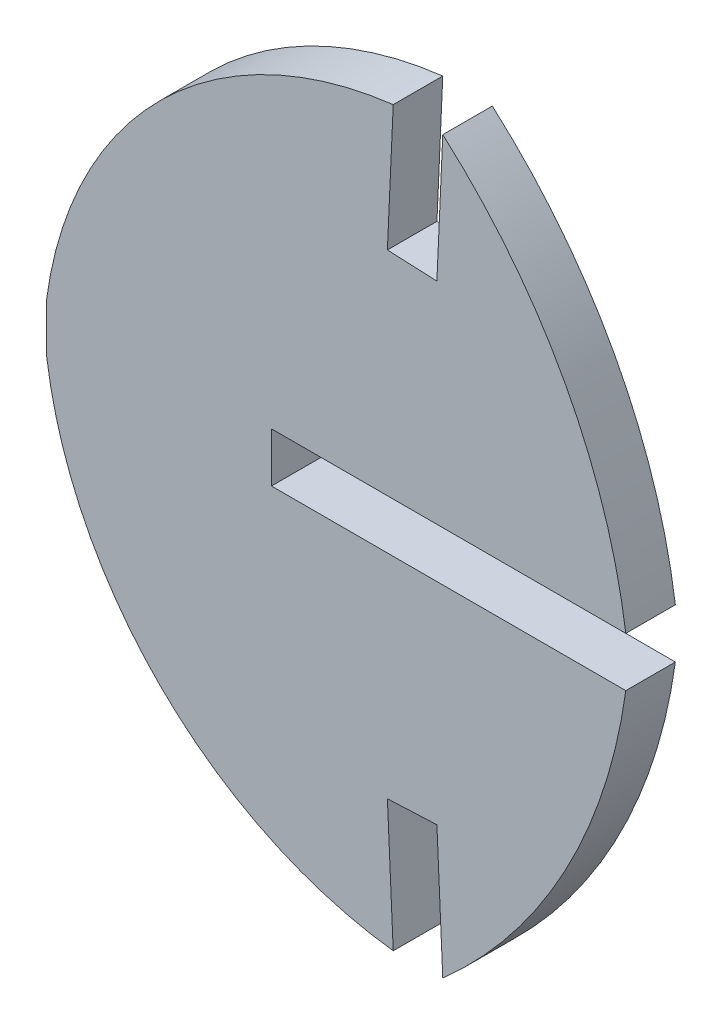
ISO-10303-21;
HEADER;
FILE_DESCRIPTION(('STEP AP214'),'2;1');
FILE_NAME('part.step','',(''),(''),'','','');
FILE_SCHEMA(('AUTOMOTIVE_DESIGN { 1 0 10303 214 1 1 1 1 }'));
ENDSEC;
DATA;
#1=APPLICATION_CONTEXT('core data for automotive mechanical design processes');
#2=APPLICATION_PROTOCOL_DEFINITION('international standard','automotive_design',2000,#1);
#3=PRODUCT_CONTEXT('',#1,'mechanical');
#4=PRODUCT('Part','Part','',(#3));
#5=PRODUCT_RELATED_PRODUCT_CATEGORY('part','',(#4));
#6=PRODUCT_DEFINITION_FORMATION('','',#4);
#7=PRODUCT_DEFINITION_CONTEXT('part definition',#1,'design');
#8=PRODUCT_DEFINITION('design','',#6,#7);
#9=PRODUCT_DEFINITION_SHAPE('','',#8);
#10=(LENGTH_UNIT() NAMED_UNIT(*) SI_UNIT(.MILLI.,.METRE.));
#11=(NAMED_UNIT(*) PLANE_ANGLE_UNIT() SI_UNIT($,.RADIAN.));
#12=(NAMED_UNIT(*) SI_UNIT($,.STERADIAN.) SOLID_ANGLE_UNIT());
#13=UNCERTAINTY_MEASURE_WITH_UNIT(LENGTH_MEASURE(1.E-05),#10,'distance_accuracy_value','');
#14=(GEOMETRIC_REPRESENTATION_CONTEXT(3) GLOBAL_UNCERTAINTY_ASSIGNED_CONTEXT((#13)) GLOBAL_UNIT_ASSIGNED_CONTEXT((#10,
#11,#12)) REPRESENTATION_CONTEXT('',''));
#15=CARTESIAN_POINT('',(0.,0.,0.));
#16=DIRECTION('',(0.,0.,1.));
#17=DIRECTION('',(1.,0.,0.));
#18=AXIS2_PLACEMENT_3D('',#15,#16,#17);
#19=CARTESIAN_POINT('',(68.0534257236926,-1.524,1.524));
#20=DIRECTION('',(0.,-1.,0.));
#21=DIRECTION('',(0.,0.,-1.));
#22=AXIS2_PLACEMENT_3D('',#19,#20,#21);
#23=PLANE('',#22);
#24=DIRECTION('',(-1.,0.,0.));
#25=VECTOR('',#24,1.);
#26=CARTESIAN_POINT('',(68.0534257236926,-1.524,0.));
#27=LINE('',#26,#25);
#28=CARTESIAN_POINT('',(78.9516589196637,-1.52399999999999,0.));
#29=VERTEX_POINT('',#28);
#30=CARTESIAN_POINT('',(68.0534257236926,-1.524,0.));
#31=VERTEX_POINT('',#30);
#32=EDGE_CURVE('E165',#29,#31,#27,.T.);
#33=ORIENTED_EDGE('',*,*,#32,.T.);
#34=DIRECTION('',(0.,0.,-1.));
#35=VECTOR('',#34,1.);
#36=CARTESIAN_POINT('',(68.0534257236926,-1.524,1.524));
#37=LINE('',#36,#35);
#38=CARTESIAN_POINT('',(68.0534257236926,-1.524,1.524));
#39=VERTEX_POINT('',#38);
#40=EDGE_CURVE('E11',#39,#31,#37,.T.);
#41=ORIENTED_EDGE('',*,*,#40,.F.);
#42=DIRECTION('',(-1.,0.,0.));
#43=VECTOR('',#42,1.);
#44=CARTESIAN_POINT('',(68.0534257236926,-1.524,1.524));
#45=LINE('',#44,#43);
#46=CARTESIAN_POINT('',(78.9516589196637,-1.52399999999999,1.524));
#47=VERTEX_POINT('',#46);
#48=EDGE_CURVE('E191',#47,#39,#45,.T.);
#49=ORIENTED_EDGE('',*,*,#48,.F.);
#50=DIRECTION('',(0.,0.,-1.));
#51=VECTOR('',#50,1.);
#52=CARTESIAN_POINT('',(78.9516589196637,-1.52399999999999,1.524));
#53=LINE('',#52,#51);
#54=EDGE_CURVE('E161',#47,#29,#53,.T.);
#55=ORIENTED_EDGE('',*,*,#54,.T.);
#56=EDGE_LOOP('',(#33,#41,#49,#55));
#57=FACE_BOUND('',#56,.T.);
#58=ADVANCED_FACE('F33',(#57),#23,.F.);
#59=CARTESIAN_POINT('',(68.0534257236926,0.,1.524));
#60=DIRECTION('',(-1.,0.,0.));
#61=DIRECTION('',(0.,0.,1.));
#62=AXIS2_PLACEMENT_3D('',#59,#60,#61);
#63=PLANE('',#62);
#64=DIRECTION('',(0.,1.,0.));
#65=VECTOR('',#64,1.);
#66=CARTESIAN_POINT('',(68.0534257236926,0.,0.));
#67=LINE('',#66,#65);
#68=CARTESIAN_POINT('',(68.0534257236926,0.,0.));
#69=VERTEX_POINT('',#68);
#70=EDGE_CURVE('E168',#31,#69,#67,.T.);
#71=ORIENTED_EDGE('',*,*,#70,.T.);
#72=DIRECTION('',(0.,0.,-1.));
#73=VECTOR('',#72,1.);
#74=CARTESIAN_POINT('',(68.0534257236926,0.,1.524));
#75=LINE('',#74,#73);
#76=CARTESIAN_POINT('',(68.0534257236926,0.,1.524));
#77=VERTEX_POINT('',#76);
#78=EDGE_CURVE('E41',#77,#69,#75,.T.);
#79=ORIENTED_EDGE('',*,*,#78,.F.);
#80=DIRECTION('',(0.,1.,0.));
#81=VECTOR('',#80,1.);
#82=CARTESIAN_POINT('',(68.0534257236926,0.,1.524));
#83=LINE('',#82,#81);
#84=EDGE_CURVE('E110',#39,#77,#83,.T.);
#85=ORIENTED_EDGE('',*,*,#84,.F.);
#86=ORIENTED_EDGE('',*,*,#40,.T.);
#87=EDGE_LOOP('',(#71,#79,#85,#86));
#88=FACE_BOUND('',#87,.T.);
#89=ADVANCED_FACE('F279',(#88),#63,.F.);
#90=CARTESIAN_POINT('',(68.0534257236926,0.,1.524));
#91=DIRECTION('',(0.,1.,0.));
#92=DIRECTION('',(0.,0.,1.));
#93=AXIS2_PLACEMENT_3D('',#90,#91,#92);
#94=PLANE('',#93);
#95=DIRECTION('',(1.,0.,0.));
#96=VECTOR('',#95,1.);
#97=CARTESIAN_POINT('',(68.0534257236926,0.,0.));
#98=LINE('',#97,#96);
#99=CARTESIAN_POINT('',(78.9516589196637,0.,0.));
#100=VERTEX_POINT('',#99);
#101=EDGE_CURVE('E170',#69,#100,#98,.T.);
#102=ORIENTED_EDGE('',*,*,#101,.T.);
#103=DIRECTION('',(0.,0.,-1.));
#104=VECTOR('',#103,1.);
#105=CARTESIAN_POINT('',(78.9516589196637,0.,1.524));
#106=LINE('',#105,#104);
#107=CARTESIAN_POINT('',(78.9516589196637,0.,1.524));
#108=VERTEX_POINT('',#107);
#109=EDGE_CURVE('E216',#108,#100,#106,.T.);
#110=ORIENTED_EDGE('',*,*,#109,.F.);
#111=DIRECTION('',(1.,0.,0.));
#112=VECTOR('',#111,1.);
#113=CARTESIAN_POINT('',(68.0534257236926,0.,1.524));
#114=LINE('',#113,#112);
#115=EDGE_CURVE('E224',#77,#108,#114,.T.);
#116=ORIENTED_EDGE('',*,*,#115,.F.);
#117=ORIENTED_EDGE('',*,*,#78,.T.);
#118=EDGE_LOOP('',(#102,#110,#116,#117));
#119=FACE_BOUND('',#118,.T.);
#120=ADVANCED_FACE('F222',(#119),#94,.F.);
#121=CARTESIAN_POINT('',(62.0385693129607,-2.3454835980676,1.524));
#122=DIRECTION('',(0.,0.,-1.));
#123=DIRECTION('',(-1.,0.,0.));
#124=AXIS2_PLACEMENT_3D('',#121,#122,#123);
#125=CYLINDRICAL_SURFACE('',#124,17.0749492928433);
#126=CARTESIAN_POINT('',(62.0385693129607,-2.3454835980676,0.));
#127=DIRECTION('',(0.,0.,1.));
#128=DIRECTION('',(1.,0.,0.));
#129=AXIS2_PLACEMENT_3D('',#126,#127,#128);
#130=CIRCLE('',#129,17.0749492928433);
#131=CARTESIAN_POINT('',(73.3220188672817,10.4700405624286,0.));
#132=VERTEX_POINT('',#131);
#133=EDGE_CURVE('E172',#100,#132,#130,.T.);
#134=ORIENTED_EDGE('',*,*,#133,.T.);
#135=DIRECTION('',(0.,0.,-1.));
#136=VECTOR('',#135,1.);
#137=CARTESIAN_POINT('',(73.3220188672817,10.4700405624286,1.524));
#138=LINE('',#137,#136);
#139=CARTESIAN_POINT('',(73.3220188672817,10.4700405624286,1.524));
#140=VERTEX_POINT('',#139);
#141=EDGE_CURVE('E213',#140,#132,#138,.T.);
#142=ORIENTED_EDGE('',*,*,#141,.F.);
#143=CARTESIAN_POINT('',(62.0385693129607,-2.3454835980676,1.524));
#144=DIRECTION('',(0.,0.,1.));
#145=DIRECTION('',(1.,0.,0.));
#146=AXIS2_PLACEMENT_3D('',#143,#144,#145);
#147=CIRCLE('',#146,17.0749492928433);
#148=EDGE_CURVE('E242',#108,#140,#147,.T.);
#149=ORIENTED_EDGE('',*,*,#148,.F.);
#150=ORIENTED_EDGE('',*,*,#109,.T.);
#151=EDGE_LOOP('',(#134,#142,#149,#150));
#152=FACE_BOUND('',#151,.T.);
#153=ADVANCED_FACE('F233',(#152),#125,.T.);
#154=CARTESIAN_POINT('',(73.3220188672817,10.4700405624286,1.524));
#155=DIRECTION('',(0.998975287416251,-0.0452589784641539,0.));
#156=DIRECTION('',(0.0452589784641539,0.998975287416251,0.));
#157=AXIS2_PLACEMENT_3D('',#154,#155,#156);
#158=PLANE('',#157);
#159=DIRECTION('',(-0.0452589784641539,-0.998975287416251,0.));
#160=VECTOR('',#159,1.);
#161=CARTESIAN_POINT('',(73.3220188672817,10.4700405624286,0.));
#162=LINE('',#161,#160);
#163=CARTESIAN_POINT('',(73.1411601040049,6.47804955517796,0.));
#164=VERTEX_POINT('',#163);
#165=EDGE_CURVE('E174',#132,#164,#162,.T.);
#166=ORIENTED_EDGE('',*,*,#165,.T.);
#167=DIRECTION('',(0.,0.,-1.));
#168=VECTOR('',#167,1.);
#169=CARTESIAN_POINT('',(73.1411601040049,6.47804955517796,1.524));
#170=LINE('',#169,#168);
#171=CARTESIAN_POINT('',(73.1411601040049,6.47804955517796,1.524));
#172=VERTEX_POINT('',#171);
#173=EDGE_CURVE('E210',#172,#164,#170,.T.);
#174=ORIENTED_EDGE('',*,*,#173,.F.);
#175=DIRECTION('',(-0.0452589784641539,-0.998975287416251,0.));
#176=VECTOR('',#175,1.);
#177=CARTESIAN_POINT('',(73.3220188672817,10.4700405624286,1.524));
#178=LINE('',#177,#176);
#179=EDGE_CURVE('E239',#140,#172,#178,.T.);
#180=ORIENTED_EDGE('',*,*,#179,.F.);
#181=ORIENTED_EDGE('',*,*,#141,.T.);
#182=EDGE_LOOP('',(#166,#174,#180,#181));
#183=FACE_BOUND('',#182,.T.);
#184=ADVANCED_FACE('F237',(#183),#158,.F.);
#185=CARTESIAN_POINT('',(73.1411601040049,6.47804955517796,1.524));
#186=DIRECTION('',(-0.0452589784641556,-0.998975287416251,0.));
#187=DIRECTION('',(0.998975287416251,-0.0452589784641556,0.));
#188=AXIS2_PLACEMENT_3D('',#185,#186,#187);
#189=PLANE('',#188);
#190=DIRECTION('',(-0.998975287416251,0.0452589784641557,0.));
#191=VECTOR('',#190,1.);
#192=CARTESIAN_POINT('',(73.1411601040049,6.47804955517796,0.));
#193=LINE('',#192,#191);
#194=CARTESIAN_POINT('',(71.6187217659825,6.54702423835733,0.));
#195=VERTEX_POINT('',#194);
#196=EDGE_CURVE('E176',#164,#195,#193,.T.);
#197=ORIENTED_EDGE('',*,*,#196,.T.);
#198=DIRECTION('',(0.,0.,-1.));
#199=VECTOR('',#198,1.);
#200=CARTESIAN_POINT('',(71.6187217659825,6.54702423835733,1.524));
#201=LINE('',#200,#199);
#202=CARTESIAN_POINT('',(71.6187217659825,6.54702423835733,1.524));
#203=VERTEX_POINT('',#202);
#204=EDGE_CURVE('E207',#203,#195,#201,.T.);
#205=ORIENTED_EDGE('',*,*,#204,.F.);
#206=DIRECTION('',(-0.998975287416251,0.0452589784641557,0.));
#207=VECTOR('',#206,1.);
#208=CARTESIAN_POINT('',(73.1411601040049,6.47804955517796,1.524));
#209=LINE('',#208,#207);
#210=EDGE_CURVE('E241',#172,#203,#209,.T.);
#211=ORIENTED_EDGE('',*,*,#210,.F.);
#212=ORIENTED_EDGE('',*,*,#173,.T.);
#213=EDGE_LOOP('',(#197,#205,#211,#212));
#214=FACE_BOUND('',#213,.T.);
#215=ADVANCED_FACE('F292',(#214),#189,.F.);
#216=CARTESIAN_POINT('',(71.7981675730505,10.5078278794157,1.524));
#217=DIRECTION('',(-0.998975287416251,0.0452589784641583,0.));
#218=DIRECTION('',(-0.0452589784641583,-0.998975287416251,0.));
#219=AXIS2_PLACEMENT_3D('',#216,#217,#218);
#220=PLANE('',#219);
#221=DIRECTION('',(0.0452589784641583,0.998975287416251,0.));
#222=VECTOR('',#221,1.);
#223=CARTESIAN_POINT('',(71.7981675730505,10.5078278794157,0.));
#224=LINE('',#223,#222);
#225=CARTESIAN_POINT('',(71.7981675730505,10.5078278794157,0.));
#226=VERTEX_POINT('',#225);
#227=EDGE_CURVE('E178',#195,#226,#224,.T.);
#228=ORIENTED_EDGE('',*,*,#227,.T.);
#229=DIRECTION('',(0.,0.,-1.));
#230=VECTOR('',#229,1.);
#231=CARTESIAN_POINT('',(71.7981675730505,10.5078278794157,1.524));
#232=LINE('',#231,#230);
#233=CARTESIAN_POINT('',(71.7981675730505,10.5078278794157,1.524));
#234=VERTEX_POINT('',#233);
#235=EDGE_CURVE('E204',#234,#226,#232,.T.);
#236=ORIENTED_EDGE('',*,*,#235,.F.);
#237=DIRECTION('',(0.0452589784641583,0.998975287416251,0.));
#238=VECTOR('',#237,1.);
#239=CARTESIAN_POINT('',(71.7981675730505,10.5078278794157,1.524));
#240=LINE('',#239,#238);
#241=EDGE_CURVE('E244',#203,#234,#240,.T.);
#242=ORIENTED_EDGE('',*,*,#241,.F.);
#243=ORIENTED_EDGE('',*,*,#204,.T.);
#244=EDGE_LOOP('',(#228,#236,#242,#243));
#245=FACE_BOUND('',#244,.T.);
#246=ADVANCED_FACE('F295',(#245),#220,.F.);
#247=CARTESIAN_POINT('',(73.2589327826992,-1.63504155494782,1.524));
#248=DIRECTION('',(0.,0.,-1.));
#249=DIRECTION('',(-1.,0.,0.));
#250=AXIS2_PLACEMENT_3D('',#247,#248,#249);
#251=CYLINDRICAL_SURFACE('',#250,12.2304175357066);
#252=CARTESIAN_POINT('',(73.2589327826992,-1.63504155494782,0.));
#253=DIRECTION('',(0.,0.,1.));
#254=DIRECTION('',(-1.,0.,0.));
#255=AXIS2_PLACEMENT_3D('',#252,#253,#254);
#256=CIRCLE('',#255,12.2304175357066);
#257=CARTESIAN_POINT('',(61.1382994571954,0.,0.));
#258=VERTEX_POINT('',#257);
#259=EDGE_CURVE('E180',#226,#258,#256,.T.);
#260=ORIENTED_EDGE('',*,*,#259,.T.);
#261=DIRECTION('',(0.,0.,-1.));
#262=VECTOR('',#261,1.);
#263=CARTESIAN_POINT('',(61.1382994571954,0.,1.524));
#264=LINE('',#263,#262);
#265=CARTESIAN_POINT('',(61.1382994571954,0.,1.524));
#266=VERTEX_POINT('',#265);
#267=EDGE_CURVE('E201',#266,#258,#264,.T.);
#268=ORIENTED_EDGE('',*,*,#267,.F.);
#269=CARTESIAN_POINT('',(73.2589327826992,-1.63504155494782,1.524));
#270=DIRECTION('',(0.,0.,1.));
#271=DIRECTION('',(-1.,0.,0.));
#272=AXIS2_PLACEMENT_3D('',#269,#270,#271);
#273=CIRCLE('',#272,12.2304175357066);
#274=EDGE_CURVE('E250',#234,#266,#273,.T.);
#275=ORIENTED_EDGE('',*,*,#274,.F.);
#276=ORIENTED_EDGE('',*,*,#235,.T.);
#277=EDGE_LOOP('',(#260,#268,#275,#276));
#278=FACE_BOUND('',#277,.T.);
#279=ADVANCED_FACE('F299',(#278),#251,.T.);
#280=CARTESIAN_POINT('',(61.1382994571954,-1.524,1.524));
#281=DIRECTION('',(1.,0.,0.));
#282=DIRECTION('',(0.,0.,-1.));
#283=AXIS2_PLACEMENT_3D('',#280,#281,#282);
#284=PLANE('',#283);
#285=DIRECTION('',(0.,-1.,0.));
#286=VECTOR('',#285,1.);
#287=CARTESIAN_POINT('',(61.1382994571954,-1.524,0.));
#288=LINE('',#287,#286);
#289=CARTESIAN_POINT('',(61.1382994571954,-1.524,0.));
#290=VERTEX_POINT('',#289);
#291=EDGE_CURVE('E182',#258,#290,#288,.T.);
#292=ORIENTED_EDGE('',*,*,#291,.T.);
#293=DIRECTION('',(0.,0.,-1.));
#294=VECTOR('',#293,1.);
#295=CARTESIAN_POINT('',(61.1382994571954,-1.524,1.524));
#296=LINE('',#295,#294);
#297=CARTESIAN_POINT('',(61.1382994571954,-1.524,1.524));
#298=VERTEX_POINT('',#297);
#299=EDGE_CURVE('E198',#298,#290,#296,.T.);
#300=ORIENTED_EDGE('',*,*,#299,.F.);
#301=DIRECTION('',(0.,-1.,0.));
#302=VECTOR('',#301,1.);
#303=CARTESIAN_POINT('',(61.1382994571954,-1.524,1.524));
#304=LINE('',#303,#302);
#305=EDGE_CURVE('E252',#266,#298,#304,.T.);
#306=ORIENTED_EDGE('',*,*,#305,.F.);
#307=ORIENTED_EDGE('',*,*,#267,.T.);
#308=EDGE_LOOP('',(#292,#300,#306,#307));
#309=FACE_BOUND('',#308,.T.);
#310=ADVANCED_FACE('F303',(#309),#284,.F.);
#311=CARTESIAN_POINT('',(73.2589327826992,0.111041554947824,1.524));
#312=DIRECTION('',(0.,0.,-1.));
#313=DIRECTION('',(-1.,0.,0.));
#314=AXIS2_PLACEMENT_3D('',#311,#312,#313);
#315=CYLINDRICAL_SURFACE('',#314,12.2304175357066);
#316=CARTESIAN_POINT('',(73.2589327826992,0.111041554947824,0.));
#317=DIRECTION('',(0.,0.,1.));
#318=DIRECTION('',(1.,0.,0.));
#319=AXIS2_PLACEMENT_3D('',#316,#317,#318);
#320=CIRCLE('',#319,12.2304175357066);
#321=CARTESIAN_POINT('',(71.7981675730505,-12.0318278794157,0.));
#322=VERTEX_POINT('',#321);
#323=EDGE_CURVE('E184',#290,#322,#320,.T.);
#324=ORIENTED_EDGE('',*,*,#323,.T.);
#325=DIRECTION('',(0.,0.,-1.));
#326=VECTOR('',#325,1.);
#327=CARTESIAN_POINT('',(71.7981675730505,-12.0318278794157,1.524));
#328=LINE('',#327,#326);
#329=CARTESIAN_POINT('',(71.7981675730505,-12.0318278794157,1.524));
#330=VERTEX_POINT('',#329);
#331=EDGE_CURVE('E195',#330,#322,#328,.T.);
#332=ORIENTED_EDGE('',*,*,#331,.F.);
#333=CARTESIAN_POINT('',(73.2589327826992,0.111041554947824,1.524));
#334=DIRECTION('',(0.,0.,1.));
#335=DIRECTION('',(1.,0.,0.));
#336=AXIS2_PLACEMENT_3D('',#333,#334,#335);
#337=CIRCLE('',#336,12.2304175357066);
#338=EDGE_CURVE('E254',#298,#330,#337,.T.);
#339=ORIENTED_EDGE('',*,*,#338,.F.);
#340=ORIENTED_EDGE('',*,*,#299,.T.);
#341=EDGE_LOOP('',(#324,#332,#339,#340));
#342=FACE_BOUND('',#341,.T.);
#343=ADVANCED_FACE('F260',(#342),#315,.T.);
#344=CARTESIAN_POINT('',(71.7981675730505,-12.0318278794157,1.524));
#345=DIRECTION('',(-0.998975287416251,-0.0452589784641583,0.));
#346=DIRECTION('',(0.0452589784641583,-0.998975287416251,0.));
#347=AXIS2_PLACEMENT_3D('',#344,#345,#346);
#348=PLANE('',#347);
#349=DIRECTION('',(-0.0452589784641583,0.998975287416251,0.));
#350=VECTOR('',#349,1.);
#351=CARTESIAN_POINT('',(71.7981675730505,-12.0318278794157,0.));
#352=LINE('',#351,#350);
#353=CARTESIAN_POINT('',(71.6187217659825,-8.07102423835733,0.));
#354=VERTEX_POINT('',#353);
#355=EDGE_CURVE('E186',#322,#354,#352,.T.);
#356=ORIENTED_EDGE('',*,*,#355,.T.);
#357=DIRECTION('',(0.,0.,-1.));
#358=VECTOR('',#357,1.);
#359=CARTESIAN_POINT('',(71.6187217659825,-8.07102423835733,1.524));
#360=LINE('',#359,#358);
#361=CARTESIAN_POINT('',(71.6187217659825,-8.07102423835733,1.524));
#362=VERTEX_POINT('',#361);
#363=EDGE_CURVE('E156',#362,#354,#360,.T.);
#364=ORIENTED_EDGE('',*,*,#363,.F.);
#365=DIRECTION('',(-0.0452589784641583,0.998975287416251,0.));
#366=VECTOR('',#365,1.);
#367=CARTESIAN_POINT('',(71.7981675730505,-12.0318278794157,1.524));
#368=LINE('',#367,#366);
#369=EDGE_CURVE('E147',#330,#362,#368,.T.);
#370=ORIENTED_EDGE('',*,*,#369,.F.);
#371=ORIENTED_EDGE('',*,*,#331,.T.);
#372=EDGE_LOOP('',(#356,#364,#370,#371));
#373=FACE_BOUND('',#372,.T.);
#374=ADVANCED_FACE('F264',(#373),#348,.F.);
#375=CARTESIAN_POINT('',(73.1411601040049,-8.00204955517796,1.524));
#376=DIRECTION('',(-0.0452589784641556,0.998975287416251,0.));
#377=DIRECTION('',(-0.998975287416251,-0.0452589784641556,0.));
#378=AXIS2_PLACEMENT_3D('',#375,#376,#377);
#379=PLANE('',#378);
#380=DIRECTION('',(0.998975287416251,0.0452589784641557,0.));
#381=VECTOR('',#380,1.);
#382=CARTESIAN_POINT('',(73.1411601040049,-8.00204955517796,0.));
#383=LINE('',#382,#381);
#384=CARTESIAN_POINT('',(73.1411601040049,-8.00204955517796,0.));
#385=VERTEX_POINT('',#384);
#386=EDGE_CURVE('E155',#354,#385,#383,.T.);
#387=ORIENTED_EDGE('',*,*,#386,.T.);
#388=DIRECTION('',(0.,0.,-1.));
#389=VECTOR('',#388,1.);
#390=CARTESIAN_POINT('',(73.1411601040049,-8.00204955517796,1.524));
#391=LINE('',#390,#389);
#392=CARTESIAN_POINT('',(73.1411601040049,-8.00204955517796,1.524));
#393=VERTEX_POINT('',#392);
#394=EDGE_CURVE('E152',#393,#385,#391,.T.);
#395=ORIENTED_EDGE('',*,*,#394,.F.);
#396=DIRECTION('',(0.998975287416251,0.0452589784641557,0.));
#397=VECTOR('',#396,1.);
#398=CARTESIAN_POINT('',(73.1411601040049,-8.00204955517796,1.524));
#399=LINE('',#398,#397);
#400=EDGE_CURVE('E141',#362,#393,#399,.T.);
#401=ORIENTED_EDGE('',*,*,#400,.F.);
#402=ORIENTED_EDGE('',*,*,#363,.T.);
#403=EDGE_LOOP('',(#387,#395,#401,#402));
#404=FACE_BOUND('',#403,.T.);
#405=ADVANCED_FACE('F153',(#404),#379,.F.);
#406=CARTESIAN_POINT('',(73.3220188672817,-11.9940405624286,1.524));
#407=DIRECTION('',(0.998975287416251,0.0452589784641539,0.));
#408=DIRECTION('',(-0.0452589784641539,0.998975287416251,0.));
#409=AXIS2_PLACEMENT_3D('',#406,#407,#408);
#410=PLANE('',#409);
#411=DIRECTION('',(0.0452589784641539,-0.998975287416251,0.));
#412=VECTOR('',#411,1.);
#413=CARTESIAN_POINT('',(73.3220188672817,-11.9940405624286,0.));
#414=LINE('',#413,#412);
#415=CARTESIAN_POINT('',(73.3220188672817,-11.9940405624286,0.));
#416=VERTEX_POINT('',#415);
#417=EDGE_CURVE('E96',#385,#416,#414,.T.);
#418=ORIENTED_EDGE('',*,*,#417,.T.);
#419=DIRECTION('',(0.,0.,-1.));
#420=VECTOR('',#419,1.);
#421=CARTESIAN_POINT('',(73.3220188672817,-11.9940405624286,1.524));
#422=LINE('',#421,#420);
#423=CARTESIAN_POINT('',(73.3220188672817,-11.9940405624286,1.524));
#424=VERTEX_POINT('',#423);
#425=EDGE_CURVE('E157',#424,#416,#422,.T.);
#426=ORIENTED_EDGE('',*,*,#425,.F.);
#427=DIRECTION('',(0.0452589784641539,-0.998975287416251,0.));
#428=VECTOR('',#427,1.);
#429=CARTESIAN_POINT('',(73.3220188672817,-11.9940405624286,1.524));
#430=LINE('',#429,#428);
#431=EDGE_CURVE('E145',#393,#424,#430,.T.);
#432=ORIENTED_EDGE('',*,*,#431,.F.);
#433=ORIENTED_EDGE('',*,*,#394,.T.);
#434=EDGE_LOOP('',(#418,#426,#432,#433));
#435=FACE_BOUND('',#434,.T.);
#436=ADVANCED_FACE('F159',(#435),#410,.F.);
#437=CARTESIAN_POINT('',(62.0385693129607,0.821483598067597,1.524));
#438=DIRECTION('',(0.,0.,-1.));
#439=DIRECTION('',(-1.,0.,0.));
#440=AXIS2_PLACEMENT_3D('',#437,#438,#439);
#441=CYLINDRICAL_SURFACE('',#440,17.0749492928433);
#442=CARTESIAN_POINT('',(62.0385693129607,0.821483598067597,0.));
#443=DIRECTION('',(0.,0.,1.));
#444=DIRECTION('',(-1.,0.,0.));
#445=AXIS2_PLACEMENT_3D('',#442,#443,#444);
#446=CIRCLE('',#445,17.0749492928433);
#447=EDGE_CURVE('E102',#416,#29,#446,.T.);
#448=ORIENTED_EDGE('',*,*,#447,.T.);
#449=ORIENTED_EDGE('',*,*,#54,.F.);
#450=CARTESIAN_POINT('',(62.0385693129607,0.821483598067597,1.524));
#451=DIRECTION('',(0.,0.,1.));
#452=DIRECTION('',(-1.,0.,0.));
#453=AXIS2_PLACEMENT_3D('',#450,#451,#452);
#454=CIRCLE('',#453,17.0749492928433);
#455=EDGE_CURVE('E49',#424,#47,#454,.T.);
#456=ORIENTED_EDGE('',*,*,#455,.F.);
#457=ORIENTED_EDGE('',*,*,#425,.T.);
#458=EDGE_LOOP('',(#448,#449,#456,#457));
#459=FACE_BOUND('',#458,.T.);
#460=ADVANCED_FACE('F268',(#459),#441,.T.);
#461=CARTESIAN_POINT('',(62.0385693129607,0.821483598067597,1.524));
#462=DIRECTION('',(0.,0.,-1.));
#463=DIRECTION('',(-1.,0.,0.));
#464=AXIS2_PLACEMENT_3D('',#461,#462,#463);
#465=PLANE('',#464);
#466=ORIENTED_EDGE('',*,*,#48,.T.);
#467=ORIENTED_EDGE('',*,*,#84,.T.);
#468=ORIENTED_EDGE('',*,*,#115,.T.);
#469=ORIENTED_EDGE('',*,*,#148,.T.);
#470=ORIENTED_EDGE('',*,*,#179,.T.);
#471=ORIENTED_EDGE('',*,*,#210,.T.);
#472=ORIENTED_EDGE('',*,*,#241,.T.);
#473=ORIENTED_EDGE('',*,*,#274,.T.);
#474=ORIENTED_EDGE('',*,*,#305,.T.);
#475=ORIENTED_EDGE('',*,*,#338,.T.);
#476=ORIENTED_EDGE('',*,*,#369,.T.);
#477=ORIENTED_EDGE('',*,*,#400,.T.);
#478=ORIENTED_EDGE('',*,*,#431,.T.);
#479=ORIENTED_EDGE('',*,*,#455,.T.);
#480=EDGE_LOOP('',(#466,#467,#468,#469,#470,#471,#472,#473,#474,#475,#476,#477,#478,#479));
#481=FACE_BOUND('',#480,.T.);
#482=ADVANCED_FACE('F143',(#481),#465,.F.);
#483=CARTESIAN_POINT('',(62.0385693129607,0.821483598067597,0.));
#484=DIRECTION('',(0.,0.,-1.));
#485=DIRECTION('',(-1.,0.,0.));
#486=AXIS2_PLACEMENT_3D('',#483,#484,#485);
#487=PLANE('',#486);
#488=ORIENTED_EDGE('',*,*,#32,.F.);
#489=ORIENTED_EDGE('',*,*,#447,.F.);
#490=ORIENTED_EDGE('',*,*,#417,.F.);
#491=ORIENTED_EDGE('',*,*,#386,.F.);
#492=ORIENTED_EDGE('',*,*,#355,.F.);
#493=ORIENTED_EDGE('',*,*,#323,.F.);
#494=ORIENTED_EDGE('',*,*,#291,.F.);
#495=ORIENTED_EDGE('',*,*,#259,.F.);
#496=ORIENTED_EDGE('',*,*,#227,.F.);
#497=ORIENTED_EDGE('',*,*,#196,.F.);
#498=ORIENTED_EDGE('',*,*,#165,.F.);
#499=ORIENTED_EDGE('',*,*,#133,.F.);
#500=ORIENTED_EDGE('',*,*,#101,.F.);
#501=ORIENTED_EDGE('',*,*,#70,.F.);
#502=EDGE_LOOP('',(#488,#489,#490,#491,#492,#493,#494,#495,#496,#497,#498,#499,#500,#501));
#503=FACE_BOUND('',#502,.T.);
#504=ADVANCED_FACE('F228',(#503),#487,.T.);
#505=CLOSED_SHELL('',(#58,#89,#120,#153,#184,#215,#246,#279,#310,#343,#374,#405,#436,#460,#482,#504));
#506=MANIFOLD_SOLID_BREP('B2',#505);
#507=ADVANCED_BREP_SHAPE_REPRESENTATION('',(#18,#506),#14);
#508=SHAPE_DEFINITION_REPRESENTATION(#9,#507);
ENDSEC;
END-ISO-10303-21;
